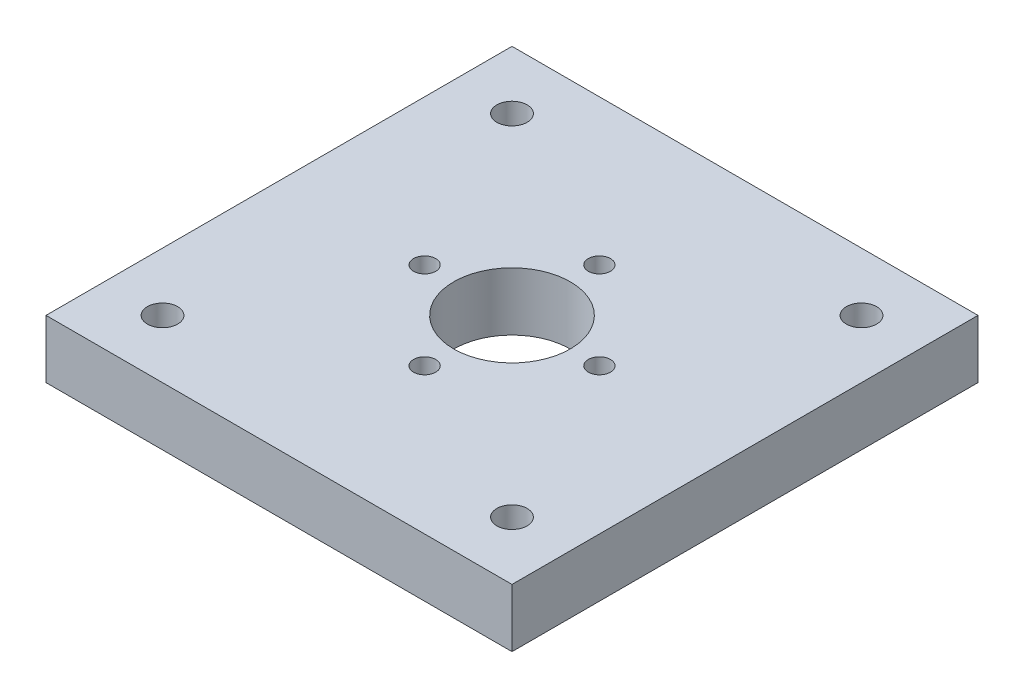
ISO-10303-21;
HEADER;
FILE_DESCRIPTION(('STEP AP214'),'2;1');
FILE_NAME('part.step','',(''),(''),'','','');
FILE_SCHEMA(('AUTOMOTIVE_DESIGN { 1 0 10303 214 1 1 1 1 }'));
ENDSEC;
DATA;
#1=APPLICATION_CONTEXT('core data for automotive mechanical design processes');
#2=APPLICATION_PROTOCOL_DEFINITION('international standard','automotive_design',2000,#1);
#3=PRODUCT_CONTEXT('',#1,'mechanical');
#4=PRODUCT('Part','Part','',(#3));
#5=PRODUCT_RELATED_PRODUCT_CATEGORY('part','',(#4));
#6=PRODUCT_DEFINITION_FORMATION('','',#4);
#7=PRODUCT_DEFINITION_CONTEXT('part definition',#1,'design');
#8=PRODUCT_DEFINITION('design','',#6,#7);
#9=PRODUCT_DEFINITION_SHAPE('','',#8);
#10=(LENGTH_UNIT() NAMED_UNIT(*) SI_UNIT(.MILLI.,.METRE.));
#11=(NAMED_UNIT(*) PLANE_ANGLE_UNIT() SI_UNIT($,.RADIAN.));
#12=(NAMED_UNIT(*) SI_UNIT($,.STERADIAN.) SOLID_ANGLE_UNIT());
#13=UNCERTAINTY_MEASURE_WITH_UNIT(LENGTH_MEASURE(1.E-05),#10,'distance_accuracy_value','');
#14=(GEOMETRIC_REPRESENTATION_CONTEXT(3) GLOBAL_UNCERTAINTY_ASSIGNED_CONTEXT((#13)) GLOBAL_UNIT_ASSIGNED_CONTEXT((#10,
#11,#12)) REPRESENTATION_CONTEXT('',''));
#15=CARTESIAN_POINT('',(0.,0.,0.));
#16=DIRECTION('',(0.,0.,1.));
#17=DIRECTION('',(1.,0.,0.));
#18=AXIS2_PLACEMENT_3D('',#15,#16,#17);
#19=CARTESIAN_POINT('',(0.,0.5,0.));
#20=DIRECTION('',(0.,1.,0.));
#21=DIRECTION('',(0.,0.,1.));
#22=AXIS2_PLACEMENT_3D('',#19,#20,#21);
#23=PLANE('',#22);
#24=CARTESIAN_POINT('',(0.,0.5,0.75));
#25=DIRECTION('',(0.,1.,0.));
#26=DIRECTION('',(0.,0.,1.));
#27=AXIS2_PLACEMENT_3D('',#24,#25,#26);
#28=CIRCLE('',#27,0.0950000000000449);
#29=CARTESIAN_POINT('',(0.,0.5,0.845000000000045));
#30=VERTEX_POINT('',#29);
#31=EDGE_CURVE('E155',#30,#30,#28,.T.);
#32=ORIENTED_EDGE('',*,*,#31,.F.);
#33=EDGE_LOOP('',(#32));
#34=FACE_BOUND('',#33,.T.);
#35=CARTESIAN_POINT('',(1.5,0.5,1.5));
#36=DIRECTION('',(0.,1.,0.));
#37=DIRECTION('',(0.,0.,-1.));
#38=AXIS2_PLACEMENT_3D('',#35,#36,#37);
#39=CIRCLE('',#38,0.13);
#40=CARTESIAN_POINT('',(1.5,0.5,1.37));
#41=VERTEX_POINT('',#40);
#42=EDGE_CURVE('E143',#41,#41,#39,.T.);
#43=ORIENTED_EDGE('',*,*,#42,.F.);
#44=EDGE_LOOP('',(#43));
#45=FACE_BOUND('',#44,.T.);
#46=CARTESIAN_POINT('',(0.75,0.5,0.));
#47=DIRECTION('',(0.,1.,0.));
#48=DIRECTION('',(0.,0.,1.));
#49=AXIS2_PLACEMENT_3D('',#46,#47,#48);
#50=CIRCLE('',#49,0.095);
#51=CARTESIAN_POINT('',(0.75,0.5,0.0950000000000023));
#52=VERTEX_POINT('',#51);
#53=EDGE_CURVE('E131',#52,#52,#50,.T.);
#54=ORIENTED_EDGE('',*,*,#53,.F.);
#55=EDGE_LOOP('',(#54));
#56=FACE_BOUND('',#55,.T.);
#57=CARTESIAN_POINT('',(-1.5,0.5,1.5));
#58=DIRECTION('',(0.,1.,0.));
#59=DIRECTION('',(0.,0.,1.));
#60=AXIS2_PLACEMENT_3D('',#57,#58,#59);
#61=CIRCLE('',#60,0.13);
#62=CARTESIAN_POINT('',(-1.5,0.5,1.63));
#63=VERTEX_POINT('',#62);
#64=EDGE_CURVE('E119',#63,#63,#61,.T.);
#65=ORIENTED_EDGE('',*,*,#64,.F.);
#66=EDGE_LOOP('',(#65));
#67=FACE_BOUND('',#66,.T.);
#68=DIRECTION('',(0.,0.,-1.));
#69=VECTOR('',#68,1.);
#70=CARTESIAN_POINT('',(2.,0.5,-2.));
#71=LINE('',#70,#69);
#72=CARTESIAN_POINT('',(2.,0.5,2.));
#73=VERTEX_POINT('',#72);
#74=CARTESIAN_POINT('',(2.,0.5,-2.));
#75=VERTEX_POINT('',#74);
#76=EDGE_CURVE('E89',#73,#75,#71,.T.);
#77=ORIENTED_EDGE('',*,*,#76,.T.);
#78=DIRECTION('',(-1.,0.,0.));
#79=VECTOR('',#78,1.);
#80=CARTESIAN_POINT('',(-2.,0.5,-2.));
#81=LINE('',#80,#79);
#82=CARTESIAN_POINT('',(-2.,0.5,-2.));
#83=VERTEX_POINT('',#82);
#84=EDGE_CURVE('E84',#75,#83,#81,.T.);
#85=ORIENTED_EDGE('',*,*,#84,.T.);
#86=DIRECTION('',(0.,0.,1.));
#87=VECTOR('',#86,1.);
#88=CARTESIAN_POINT('',(-2.,0.5,-2.));
#89=LINE('',#88,#87);
#90=CARTESIAN_POINT('',(-2.,0.5,2.));
#91=VERTEX_POINT('',#90);
#92=EDGE_CURVE('E87',#83,#91,#89,.T.);
#93=ORIENTED_EDGE('',*,*,#92,.T.);
#94=DIRECTION('',(1.,0.,0.));
#95=VECTOR('',#94,1.);
#96=CARTESIAN_POINT('',(-2.,0.5,2.));
#97=LINE('',#96,#95);
#98=EDGE_CURVE('E54',#91,#73,#97,.T.);
#99=ORIENTED_EDGE('',*,*,#98,.T.);
#100=EDGE_LOOP('',(#77,#85,#93,#99));
#101=FACE_BOUND('',#100,.T.);
#102=CARTESIAN_POINT('',(-1.5,0.5,-1.5));
#103=DIRECTION('',(0.,1.,0.));
#104=DIRECTION('',(0.,0.,1.));
#105=AXIS2_PLACEMENT_3D('',#102,#103,#104);
#106=CIRCLE('',#105,0.13);
#107=CARTESIAN_POINT('',(-1.5,0.5,-1.37));
#108=VERTEX_POINT('',#107);
#109=EDGE_CURVE('E104',#108,#108,#106,.T.);
#110=ORIENTED_EDGE('',*,*,#109,.F.);
#111=EDGE_LOOP('',(#110));
#112=FACE_BOUND('',#111,.T.);
#113=CARTESIAN_POINT('',(0.,0.5,-0.75));
#114=DIRECTION('',(0.,1.,0.));
#115=DIRECTION('',(0.,0.,1.));
#116=AXIS2_PLACEMENT_3D('',#113,#114,#115);
#117=CIRCLE('',#116,0.095);
#118=CARTESIAN_POINT('',(0.,0.5,-0.655));
#119=VERTEX_POINT('',#118);
#120=EDGE_CURVE('E125',#119,#119,#117,.T.);
#121=ORIENTED_EDGE('',*,*,#120,.F.);
#122=EDGE_LOOP('',(#121));
#123=FACE_BOUND('',#122,.T.);
#124=CARTESIAN_POINT('',(0.,0.5,0.));
#125=DIRECTION('',(0.,1.,0.));
#126=DIRECTION('',(0.,0.,1.));
#127=AXIS2_PLACEMENT_3D('',#124,#125,#126);
#128=CIRCLE('',#127,0.5);
#129=CARTESIAN_POINT('',(0.,0.5,0.5));
#130=VERTEX_POINT('',#129);
#131=EDGE_CURVE('E137',#130,#130,#128,.T.);
#132=ORIENTED_EDGE('',*,*,#131,.F.);
#133=EDGE_LOOP('',(#132));
#134=FACE_BOUND('',#133,.T.);
#135=CARTESIAN_POINT('',(1.5,0.5,-1.5));
#136=DIRECTION('',(0.,1.,0.));
#137=DIRECTION('',(0.,0.,-1.));
#138=AXIS2_PLACEMENT_3D('',#135,#136,#137);
#139=CIRCLE('',#138,0.13);
#140=CARTESIAN_POINT('',(1.5,0.5,-1.63));
#141=VERTEX_POINT('',#140);
#142=EDGE_CURVE('E149',#141,#141,#139,.T.);
#143=ORIENTED_EDGE('',*,*,#142,.F.);
#144=EDGE_LOOP('',(#143));
#145=FACE_BOUND('',#144,.T.);
#146=CARTESIAN_POINT('',(-0.75,0.5,0.));
#147=DIRECTION('',(0.,1.,0.));
#148=DIRECTION('',(0.,0.,1.));
#149=AXIS2_PLACEMENT_3D('',#146,#147,#148);
#150=CIRCLE('',#149,0.095);
#151=CARTESIAN_POINT('',(-0.75,0.5,0.0949999999999923));
#152=VERTEX_POINT('',#151);
#153=EDGE_CURVE('E161',#152,#152,#150,.T.);
#154=ORIENTED_EDGE('',*,*,#153,.F.);
#155=EDGE_LOOP('',(#154));
#156=FACE_BOUND('',#155,.T.);
#157=ADVANCED_FACE('F37',(#34,#45,#56,#67,#101,#112,#123,#134,#145,#156),#23,.T.);
#158=CARTESIAN_POINT('',(0.,0.,0.));
#159=DIRECTION('',(0.,1.,0.));
#160=DIRECTION('',(0.,0.,1.));
#161=AXIS2_PLACEMENT_3D('',#158,#159,#160);
#162=PLANE('',#161);
#163=DIRECTION('',(0.,0.,-1.));
#164=VECTOR('',#163,1.);
#165=CARTESIAN_POINT('',(2.,0.,-2.));
#166=LINE('',#165,#164);
#167=CARTESIAN_POINT('',(2.,0.,2.));
#168=VERTEX_POINT('',#167);
#169=CARTESIAN_POINT('',(2.,0.,-2.));
#170=VERTEX_POINT('',#169);
#171=EDGE_CURVE('E101',#168,#170,#166,.T.);
#172=ORIENTED_EDGE('',*,*,#171,.F.);
#173=DIRECTION('',(1.,0.,0.));
#174=VECTOR('',#173,1.);
#175=CARTESIAN_POINT('',(-2.,0.,2.));
#176=LINE('',#175,#174);
#177=CARTESIAN_POINT('',(-2.,0.,2.));
#178=VERTEX_POINT('',#177);
#179=EDGE_CURVE('E77',#178,#168,#176,.T.);
#180=ORIENTED_EDGE('',*,*,#179,.F.);
#181=DIRECTION('',(0.,0.,1.));
#182=VECTOR('',#181,1.);
#183=CARTESIAN_POINT('',(-2.,0.,-2.));
#184=LINE('',#183,#182);
#185=CARTESIAN_POINT('',(-2.,0.,-2.));
#186=VERTEX_POINT('',#185);
#187=EDGE_CURVE('E71',#186,#178,#184,.T.);
#188=ORIENTED_EDGE('',*,*,#187,.F.);
#189=DIRECTION('',(-1.,0.,0.));
#190=VECTOR('',#189,1.);
#191=CARTESIAN_POINT('',(-2.,0.,-2.));
#192=LINE('',#191,#190);
#193=EDGE_CURVE('E93',#170,#186,#192,.T.);
#194=ORIENTED_EDGE('',*,*,#193,.F.);
#195=EDGE_LOOP('',(#172,#180,#188,#194));
#196=FACE_BOUND('',#195,.T.);
#197=CARTESIAN_POINT('',(-1.5,0.,-1.5));
#198=DIRECTION('',(0.,1.,0.));
#199=DIRECTION('',(0.,0.,1.));
#200=AXIS2_PLACEMENT_3D('',#197,#198,#199);
#201=CIRCLE('',#200,0.13);
#202=CARTESIAN_POINT('',(-1.5,0.,-1.37));
#203=VERTEX_POINT('',#202);
#204=EDGE_CURVE('E116',#203,#203,#201,.T.);
#205=ORIENTED_EDGE('',*,*,#204,.T.);
#206=EDGE_LOOP('',(#205));
#207=FACE_BOUND('',#206,.T.);
#208=CARTESIAN_POINT('',(-1.5,0.,1.5));
#209=DIRECTION('',(0.,1.,0.));
#210=DIRECTION('',(0.,0.,1.));
#211=AXIS2_PLACEMENT_3D('',#208,#209,#210);
#212=CIRCLE('',#211,0.13);
#213=CARTESIAN_POINT('',(-1.5,0.,1.63));
#214=VERTEX_POINT('',#213);
#215=EDGE_CURVE('E122',#214,#214,#212,.T.);
#216=ORIENTED_EDGE('',*,*,#215,.T.);
#217=EDGE_LOOP('',(#216));
#218=FACE_BOUND('',#217,.T.);
#219=CARTESIAN_POINT('',(0.,0.,-0.75));
#220=DIRECTION('',(0.,1.,0.));
#221=DIRECTION('',(0.,0.,1.));
#222=AXIS2_PLACEMENT_3D('',#219,#220,#221);
#223=CIRCLE('',#222,0.095);
#224=CARTESIAN_POINT('',(0.,0.,-0.655));
#225=VERTEX_POINT('',#224);
#226=EDGE_CURVE('E128',#225,#225,#223,.T.);
#227=ORIENTED_EDGE('',*,*,#226,.T.);
#228=EDGE_LOOP('',(#227));
#229=FACE_BOUND('',#228,.T.);
#230=CARTESIAN_POINT('',(0.75,0.,0.));
#231=DIRECTION('',(0.,1.,0.));
#232=DIRECTION('',(0.,0.,1.));
#233=AXIS2_PLACEMENT_3D('',#230,#231,#232);
#234=CIRCLE('',#233,0.095);
#235=CARTESIAN_POINT('',(0.75,0.,0.0950000000000023));
#236=VERTEX_POINT('',#235);
#237=EDGE_CURVE('E134',#236,#236,#234,.T.);
#238=ORIENTED_EDGE('',*,*,#237,.T.);
#239=EDGE_LOOP('',(#238));
#240=FACE_BOUND('',#239,.T.);
#241=CARTESIAN_POINT('',(0.,0.,0.));
#242=DIRECTION('',(0.,1.,0.));
#243=DIRECTION('',(0.,0.,1.));
#244=AXIS2_PLACEMENT_3D('',#241,#242,#243);
#245=CIRCLE('',#244,0.5);
#246=CARTESIAN_POINT('',(0.,0.,0.5));
#247=VERTEX_POINT('',#246);
#248=EDGE_CURVE('E140',#247,#247,#245,.T.);
#249=ORIENTED_EDGE('',*,*,#248,.T.);
#250=EDGE_LOOP('',(#249));
#251=FACE_BOUND('',#250,.T.);
#252=CARTESIAN_POINT('',(1.5,0.,1.5));
#253=DIRECTION('',(0.,1.,0.));
#254=DIRECTION('',(0.,0.,-1.));
#255=AXIS2_PLACEMENT_3D('',#252,#253,#254);
#256=CIRCLE('',#255,0.13);
#257=CARTESIAN_POINT('',(1.5,0.,1.37));
#258=VERTEX_POINT('',#257);
#259=EDGE_CURVE('E146',#258,#258,#256,.T.);
#260=ORIENTED_EDGE('',*,*,#259,.T.);
#261=EDGE_LOOP('',(#260));
#262=FACE_BOUND('',#261,.T.);
#263=CARTESIAN_POINT('',(1.5,0.,-1.5));
#264=DIRECTION('',(0.,1.,0.));
#265=DIRECTION('',(0.,0.,-1.));
#266=AXIS2_PLACEMENT_3D('',#263,#264,#265);
#267=CIRCLE('',#266,0.13);
#268=CARTESIAN_POINT('',(1.5,0.,-1.63));
#269=VERTEX_POINT('',#268);
#270=EDGE_CURVE('E152',#269,#269,#267,.T.);
#271=ORIENTED_EDGE('',*,*,#270,.T.);
#272=EDGE_LOOP('',(#271));
#273=FACE_BOUND('',#272,.T.);
#274=CARTESIAN_POINT('',(0.,0.,0.75));
#275=DIRECTION('',(0.,1.,0.));
#276=DIRECTION('',(0.,0.,1.));
#277=AXIS2_PLACEMENT_3D('',#274,#275,#276);
#278=CIRCLE('',#277,0.0950000000000449);
#279=CARTESIAN_POINT('',(0.,0.,0.845000000000045));
#280=VERTEX_POINT('',#279);
#281=EDGE_CURVE('E158',#280,#280,#278,.T.);
#282=ORIENTED_EDGE('',*,*,#281,.T.);
#283=EDGE_LOOP('',(#282));
#284=FACE_BOUND('',#283,.T.);
#285=CARTESIAN_POINT('',(-0.75,0.,0.));
#286=DIRECTION('',(0.,1.,0.));
#287=DIRECTION('',(0.,0.,1.));
#288=AXIS2_PLACEMENT_3D('',#285,#286,#287);
#289=CIRCLE('',#288,0.095);
#290=CARTESIAN_POINT('',(-0.75,0.,0.0949999999999923));
#291=VERTEX_POINT('',#290);
#292=EDGE_CURVE('E164',#291,#291,#289,.T.);
#293=ORIENTED_EDGE('',*,*,#292,.T.);
#294=EDGE_LOOP('',(#293));
#295=FACE_BOUND('',#294,.T.);
#296=ADVANCED_FACE('F112',(#196,#207,#218,#229,#240,#251,#262,#273,#284,#295),#162,.F.);
#297=CARTESIAN_POINT('',(2.,0.5,-2.));
#298=DIRECTION('',(-1.,0.,0.));
#299=DIRECTION('',(0.,0.,1.));
#300=AXIS2_PLACEMENT_3D('',#297,#298,#299);
#301=PLANE('',#300);
#302=ORIENTED_EDGE('',*,*,#171,.T.);
#303=DIRECTION('',(0.,-1.,0.));
#304=VECTOR('',#303,1.);
#305=CARTESIAN_POINT('',(2.,0.5,-2.));
#306=LINE('',#305,#304);
#307=EDGE_CURVE('E11',#75,#170,#306,.T.);
#308=ORIENTED_EDGE('',*,*,#307,.F.);
#309=ORIENTED_EDGE('',*,*,#76,.F.);
#310=DIRECTION('',(0.,-1.,0.));
#311=VECTOR('',#310,1.);
#312=CARTESIAN_POINT('',(2.,0.5,2.));
#313=LINE('',#312,#311);
#314=EDGE_CURVE('E97',#73,#168,#313,.T.);
#315=ORIENTED_EDGE('',*,*,#314,.T.);
#316=EDGE_LOOP('',(#302,#308,#309,#315));
#317=FACE_BOUND('',#316,.T.);
#318=ADVANCED_FACE('F39',(#317),#301,.F.);
#319=CARTESIAN_POINT('',(-2.,0.5,-2.));
#320=DIRECTION('',(0.,0.,1.));
#321=DIRECTION('',(1.,0.,0.));
#322=AXIS2_PLACEMENT_3D('',#319,#320,#321);
#323=PLANE('',#322);
#324=ORIENTED_EDGE('',*,*,#193,.T.);
#325=DIRECTION('',(0.,-1.,0.));
#326=VECTOR('',#325,1.);
#327=CARTESIAN_POINT('',(-2.,0.5,-2.));
#328=LINE('',#327,#326);
#329=EDGE_CURVE('E46',#83,#186,#328,.T.);
#330=ORIENTED_EDGE('',*,*,#329,.F.);
#331=ORIENTED_EDGE('',*,*,#84,.F.);
#332=ORIENTED_EDGE('',*,*,#307,.T.);
#333=EDGE_LOOP('',(#324,#330,#331,#332));
#334=FACE_BOUND('',#333,.T.);
#335=ADVANCED_FACE('F92',(#334),#323,.F.);
#336=CARTESIAN_POINT('',(-2.,0.5,-2.));
#337=DIRECTION('',(1.,0.,0.));
#338=DIRECTION('',(0.,0.,-1.));
#339=AXIS2_PLACEMENT_3D('',#336,#337,#338);
#340=PLANE('',#339);
#341=ORIENTED_EDGE('',*,*,#187,.T.);
#342=DIRECTION('',(0.,-1.,0.));
#343=VECTOR('',#342,1.);
#344=CARTESIAN_POINT('',(-2.,0.5,2.));
#345=LINE('',#344,#343);
#346=EDGE_CURVE('E94',#91,#178,#345,.T.);
#347=ORIENTED_EDGE('',*,*,#346,.F.);
#348=ORIENTED_EDGE('',*,*,#92,.F.);
#349=ORIENTED_EDGE('',*,*,#329,.T.);
#350=EDGE_LOOP('',(#341,#347,#348,#349));
#351=FACE_BOUND('',#350,.T.);
#352=ADVANCED_FACE('F95',(#351),#340,.F.);
#353=CARTESIAN_POINT('',(-2.,0.5,2.));
#354=DIRECTION('',(0.,0.,-1.));
#355=DIRECTION('',(-1.,0.,0.));
#356=AXIS2_PLACEMENT_3D('',#353,#354,#355);
#357=PLANE('',#356);
#358=ORIENTED_EDGE('',*,*,#179,.T.);
#359=ORIENTED_EDGE('',*,*,#314,.F.);
#360=ORIENTED_EDGE('',*,*,#98,.F.);
#361=ORIENTED_EDGE('',*,*,#346,.T.);
#362=EDGE_LOOP('',(#358,#359,#360,#361));
#363=FACE_BOUND('',#362,.T.);
#364=ADVANCED_FACE('F109',(#363),#357,.F.);
#365=CARTESIAN_POINT('',(-1.5,0.5,-1.5));
#366=DIRECTION('',(0.,-1.,0.));
#367=DIRECTION('',(0.,0.,-1.));
#368=AXIS2_PLACEMENT_3D('',#365,#366,#367);
#369=CYLINDRICAL_SURFACE('',#368,0.13);
#370=ORIENTED_EDGE('',*,*,#109,.T.);
#371=EDGE_LOOP('',(#370));
#372=FACE_BOUND('',#371,.T.);
#373=ORIENTED_EDGE('',*,*,#204,.F.);
#374=EDGE_LOOP('',(#373));
#375=FACE_BOUND('',#374,.T.);
#376=ADVANCED_FACE('F183',(#372,#375),#369,.F.);
#377=CARTESIAN_POINT('',(-1.5,0.5,1.5));
#378=DIRECTION('',(0.,-1.,0.));
#379=DIRECTION('',(0.,0.,-1.));
#380=AXIS2_PLACEMENT_3D('',#377,#378,#379);
#381=CYLINDRICAL_SURFACE('',#380,0.13);
#382=ORIENTED_EDGE('',*,*,#64,.T.);
#383=EDGE_LOOP('',(#382));
#384=FACE_BOUND('',#383,.T.);
#385=ORIENTED_EDGE('',*,*,#215,.F.);
#386=EDGE_LOOP('',(#385));
#387=FACE_BOUND('',#386,.T.);
#388=ADVANCED_FACE('F237',(#384,#387),#381,.F.);
#389=CARTESIAN_POINT('',(0.,0.5,-0.75));
#390=DIRECTION('',(0.,-1.,0.));
#391=DIRECTION('',(0.,0.,-1.));
#392=AXIS2_PLACEMENT_3D('',#389,#390,#391);
#393=CYLINDRICAL_SURFACE('',#392,0.095);
#394=ORIENTED_EDGE('',*,*,#120,.T.);
#395=EDGE_LOOP('',(#394));
#396=FACE_BOUND('',#395,.T.);
#397=ORIENTED_EDGE('',*,*,#226,.F.);
#398=EDGE_LOOP('',(#397));
#399=FACE_BOUND('',#398,.T.);
#400=ADVANCED_FACE('F246',(#396,#399),#393,.F.);
#401=CARTESIAN_POINT('',(0.75,0.5,0.));
#402=DIRECTION('',(0.,-1.,0.));
#403=DIRECTION('',(0.,0.,-1.));
#404=AXIS2_PLACEMENT_3D('',#401,#402,#403);
#405=CYLINDRICAL_SURFACE('',#404,0.095);
#406=ORIENTED_EDGE('',*,*,#53,.T.);
#407=EDGE_LOOP('',(#406));
#408=FACE_BOUND('',#407,.T.);
#409=ORIENTED_EDGE('',*,*,#237,.F.);
#410=EDGE_LOOP('',(#409));
#411=FACE_BOUND('',#410,.T.);
#412=ADVANCED_FACE('F255',(#408,#411),#405,.F.);
#413=CARTESIAN_POINT('',(0.,0.5,0.));
#414=DIRECTION('',(0.,-1.,0.));
#415=DIRECTION('',(0.,0.,-1.));
#416=AXIS2_PLACEMENT_3D('',#413,#414,#415);
#417=CYLINDRICAL_SURFACE('',#416,0.5);
#418=ORIENTED_EDGE('',*,*,#131,.T.);
#419=EDGE_LOOP('',(#418));
#420=FACE_BOUND('',#419,.T.);
#421=ORIENTED_EDGE('',*,*,#248,.F.);
#422=EDGE_LOOP('',(#421));
#423=FACE_BOUND('',#422,.T.);
#424=ADVANCED_FACE('F265',(#420,#423),#417,.F.);
#425=CARTESIAN_POINT('',(1.5,0.5,1.5));
#426=DIRECTION('',(0.,-1.,0.));
#427=DIRECTION('',(0.,0.,-1.));
#428=AXIS2_PLACEMENT_3D('',#425,#426,#427);
#429=CYLINDRICAL_SURFACE('',#428,0.13);
#430=ORIENTED_EDGE('',*,*,#42,.T.);
#431=EDGE_LOOP('',(#430));
#432=FACE_BOUND('',#431,.T.);
#433=ORIENTED_EDGE('',*,*,#259,.F.);
#434=EDGE_LOOP('',(#433));
#435=FACE_BOUND('',#434,.T.);
#436=ADVANCED_FACE('F275',(#432,#435),#429,.F.);
#437=CARTESIAN_POINT('',(1.5,0.5,-1.5));
#438=DIRECTION('',(0.,-1.,0.));
#439=DIRECTION('',(0.,0.,-1.));
#440=AXIS2_PLACEMENT_3D('',#437,#438,#439);
#441=CYLINDRICAL_SURFACE('',#440,0.13);
#442=ORIENTED_EDGE('',*,*,#142,.T.);
#443=EDGE_LOOP('',(#442));
#444=FACE_BOUND('',#443,.T.);
#445=ORIENTED_EDGE('',*,*,#270,.F.);
#446=EDGE_LOOP('',(#445));
#447=FACE_BOUND('',#446,.T.);
#448=ADVANCED_FACE('F285',(#444,#447),#441,.F.);
#449=CARTESIAN_POINT('',(0.,0.5,0.75));
#450=DIRECTION('',(0.,-1.,0.));
#451=DIRECTION('',(0.,0.,-1.));
#452=AXIS2_PLACEMENT_3D('',#449,#450,#451);
#453=CYLINDRICAL_SURFACE('',#452,0.0950000000000449);
#454=ORIENTED_EDGE('',*,*,#31,.T.);
#455=EDGE_LOOP('',(#454));
#456=FACE_BOUND('',#455,.T.);
#457=ORIENTED_EDGE('',*,*,#281,.F.);
#458=EDGE_LOOP('',(#457));
#459=FACE_BOUND('',#458,.T.);
#460=ADVANCED_FACE('F295',(#456,#459),#453,.F.);
#461=CARTESIAN_POINT('',(-0.75,0.5,0.));
#462=DIRECTION('',(0.,-1.,0.));
#463=DIRECTION('',(0.,0.,-1.));
#464=AXIS2_PLACEMENT_3D('',#461,#462,#463);
#465=CYLINDRICAL_SURFACE('',#464,0.095);
#466=ORIENTED_EDGE('',*,*,#153,.T.);
#467=EDGE_LOOP('',(#466));
#468=FACE_BOUND('',#467,.T.);
#469=ORIENTED_EDGE('',*,*,#292,.F.);
#470=EDGE_LOOP('',(#469));
#471=FACE_BOUND('',#470,.T.);
#472=ADVANCED_FACE('F170',(#468,#471),#465,.F.);
#473=CLOSED_SHELL('',(#157,#296,#318,#335,#352,#364,#376,#388,#400,#412,#424,#436,#448,#460,#472));
#474=MANIFOLD_SOLID_BREP('B2',#473);
#475=ADVANCED_BREP_SHAPE_REPRESENTATION('',(#18,#474),#14);
#476=SHAPE_DEFINITION_REPRESENTATION(#9,#475);
ENDSEC;
END-ISO-10303-21;
